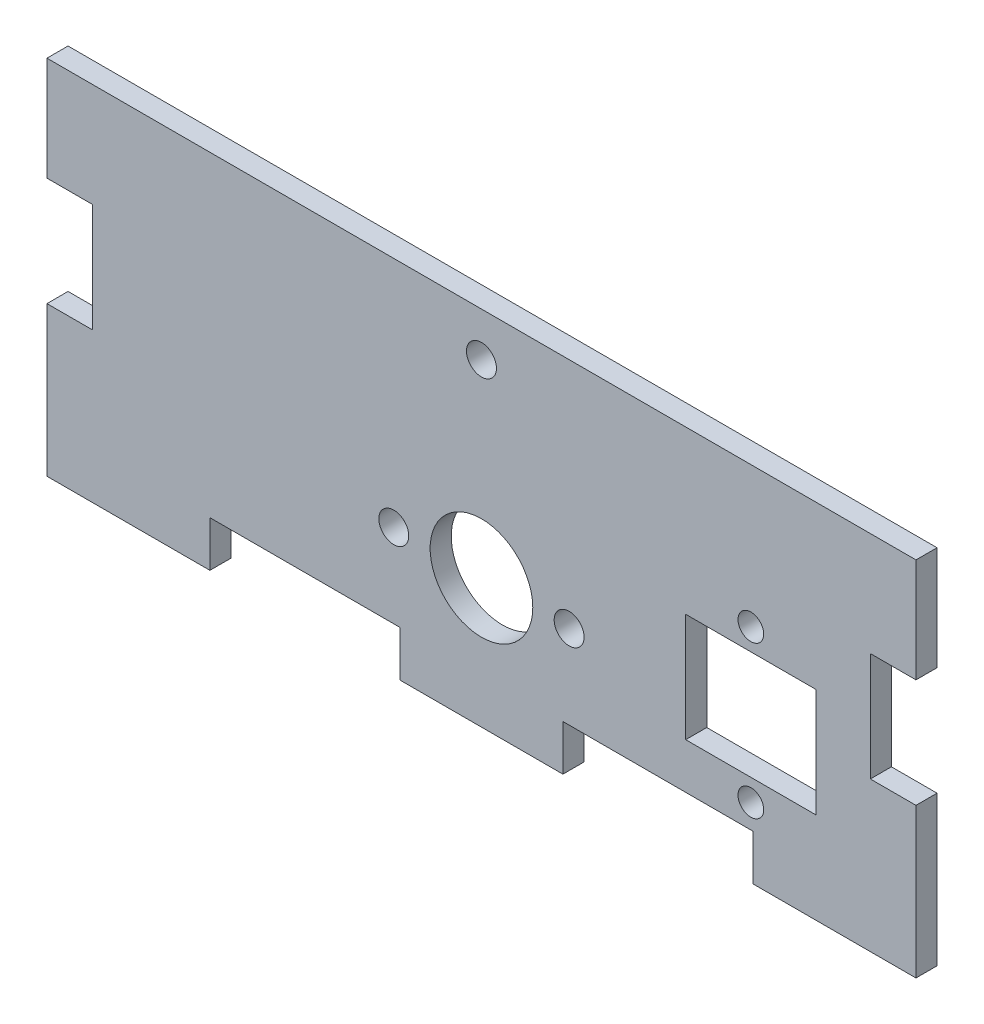
ISO-10303-21;
HEADER;
FILE_DESCRIPTION(('STEP AP214'),'2;1');
FILE_NAME('part.step','',(''),(''),'','','');
FILE_SCHEMA(('AUTOMOTIVE_DESIGN { 1 0 10303 214 1 1 1 1 }'));
ENDSEC;
DATA;
#1=APPLICATION_CONTEXT('core data for automotive mechanical design processes');
#2=APPLICATION_PROTOCOL_DEFINITION('international standard','automotive_design',2000,#1);
#3=PRODUCT_CONTEXT('',#1,'mechanical');
#4=PRODUCT('Part','Part','',(#3));
#5=PRODUCT_RELATED_PRODUCT_CATEGORY('part','',(#4));
#6=PRODUCT_DEFINITION_FORMATION('','',#4);
#7=PRODUCT_DEFINITION_CONTEXT('part definition',#1,'design');
#8=PRODUCT_DEFINITION('design','',#6,#7);
#9=PRODUCT_DEFINITION_SHAPE('','',#8);
#10=(LENGTH_UNIT() NAMED_UNIT(*) SI_UNIT(.MILLI.,.METRE.));
#11=(NAMED_UNIT(*) PLANE_ANGLE_UNIT() SI_UNIT($,.RADIAN.));
#12=(NAMED_UNIT(*) SI_UNIT($,.STERADIAN.) SOLID_ANGLE_UNIT());
#13=UNCERTAINTY_MEASURE_WITH_UNIT(LENGTH_MEASURE(1.E-05),#10,'distance_accuracy_value','');
#14=(GEOMETRIC_REPRESENTATION_CONTEXT(3) GLOBAL_UNCERTAINTY_ASSIGNED_CONTEXT((#13)) GLOBAL_UNIT_ASSIGNED_CONTEXT((#10,
#11,#12)) REPRESENTATION_CONTEXT('',''));
#15=CARTESIAN_POINT('',(0.,0.,0.));
#16=DIRECTION('',(0.,0.,1.));
#17=DIRECTION('',(1.,0.,0.));
#18=AXIS2_PLACEMENT_3D('',#15,#16,#17);
#19=CARTESIAN_POINT('',(-50.8,18.5,-2.4638));
#20=DIRECTION('',(-1.,0.,0.));
#21=DIRECTION('',(0.,-1.,0.));
#22=AXIS2_PLACEMENT_3D('',#19,#20,#21);
#23=PLANE('',#22);
#24=DIRECTION('',(0.,0.,1.));
#25=VECTOR('',#24,1.);
#26=CARTESIAN_POINT('',(-50.8,6.34999999999998,-2.46385));
#27=LINE('',#26,#25);
#28=CARTESIAN_POINT('',(-50.8,6.34999999999998,-2.4638));
#29=VERTEX_POINT('',#28);
#30=CARTESIAN_POINT('',(-50.8,6.34999999999998,0.));
#31=VERTEX_POINT('',#30);
#32=EDGE_CURVE('E240',#29,#31,#27,.T.);
#33=ORIENTED_EDGE('',*,*,#32,.T.);
#34=DIRECTION('',(0.,-1.,0.));
#35=VECTOR('',#34,1.);
#36=CARTESIAN_POINT('',(-50.8,18.5,0.));
#37=LINE('',#36,#35);
#38=CARTESIAN_POINT('',(-50.8,18.5,0.));
#39=VERTEX_POINT('',#38);
#40=EDGE_CURVE('E360',#39,#31,#37,.T.);
#41=ORIENTED_EDGE('',*,*,#40,.F.);
#42=DIRECTION('',(0.,0.,1.));
#43=VECTOR('',#42,1.);
#44=CARTESIAN_POINT('',(-50.8,18.5,-2.4638));
#45=LINE('',#44,#43);
#46=CARTESIAN_POINT('',(-50.8,18.5,-2.4638));
#47=VERTEX_POINT('',#46);
#48=EDGE_CURVE('E11',#47,#39,#45,.T.);
#49=ORIENTED_EDGE('',*,*,#48,.F.);
#50=DIRECTION('',(0.,-1.,0.));
#51=VECTOR('',#50,1.);
#52=CARTESIAN_POINT('',(-50.8,18.5,-2.4638));
#53=LINE('',#52,#51);
#54=EDGE_CURVE('E378',#47,#29,#53,.T.);
#55=ORIENTED_EDGE('',*,*,#54,.T.);
#56=EDGE_LOOP('',(#33,#41,#49,#55));
#57=FACE_BOUND('',#56,.T.);
#58=ADVANCED_FACE('F32',(#57),#23,.T.);
#59=CARTESIAN_POINT('',(50.8,18.5,-2.4638));
#60=DIRECTION('',(1.,0.,0.));
#61=DIRECTION('',(0.,1.,0.));
#62=AXIS2_PLACEMENT_3D('',#59,#60,#61);
#63=PLANE('',#62);
#64=DIRECTION('',(0.,0.,1.));
#65=VECTOR('',#64,1.);
#66=CARTESIAN_POINT('',(50.8,-6.34999999999999,-2.46385));
#67=LINE('',#66,#65);
#68=CARTESIAN_POINT('',(50.8,-6.34999999999999,-2.4638));
#69=VERTEX_POINT('',#68);
#70=CARTESIAN_POINT('',(50.8,-6.34999999999999,0.));
#71=VERTEX_POINT('',#70);
#72=EDGE_CURVE('E267',#69,#71,#67,.T.);
#73=ORIENTED_EDGE('',*,*,#72,.T.);
#74=DIRECTION('',(0.,1.,0.));
#75=VECTOR('',#74,1.);
#76=CARTESIAN_POINT('',(50.8,18.5,0.));
#77=LINE('',#76,#75);
#78=CARTESIAN_POINT('',(50.8,-23.834,0.));
#79=VERTEX_POINT('',#78);
#80=EDGE_CURVE('E393',#79,#71,#77,.T.);
#81=ORIENTED_EDGE('',*,*,#80,.F.);
#82=DIRECTION('',(0.,0.,1.));
#83=VECTOR('',#82,1.);
#84=CARTESIAN_POINT('',(50.8,-23.834,0.));
#85=LINE('',#84,#83);
#86=CARTESIAN_POINT('',(50.8,-23.834,-2.4638));
#87=VERTEX_POINT('',#86);
#88=EDGE_CURVE('E293',#87,#79,#85,.T.);
#89=ORIENTED_EDGE('',*,*,#88,.F.);
#90=DIRECTION('',(0.,1.,0.));
#91=VECTOR('',#90,1.);
#92=CARTESIAN_POINT('',(50.8,18.5,-2.4638));
#93=LINE('',#92,#91);
#94=EDGE_CURVE('E461',#87,#69,#93,.T.);
#95=ORIENTED_EDGE('',*,*,#94,.T.);
#96=EDGE_LOOP('',(#73,#81,#89,#95));
#97=FACE_BOUND('',#96,.T.);
#98=ADVANCED_FACE('F460',(#97),#63,.T.);
#99=CARTESIAN_POINT('',(-50.8,-18.5,-2.4638));
#100=DIRECTION('',(0.,-1.,0.));
#101=DIRECTION('',(0.,0.,-1.));
#102=AXIS2_PLACEMENT_3D('',#99,#100,#101);
#103=PLANE('',#102);
#104=DIRECTION('',(1.,0.,0.));
#105=VECTOR('',#104,1.);
#106=CARTESIAN_POINT('',(-50.8,-18.5,-2.4638));
#107=LINE('',#106,#105);
#108=CARTESIAN_POINT('',(9.525,-18.5,-2.4638));
#109=VERTEX_POINT('',#108);
#110=CARTESIAN_POINT('',(31.75,-18.5,-2.4638));
#111=VERTEX_POINT('',#110);
#112=EDGE_CURVE('E36',#109,#111,#107,.T.);
#113=ORIENTED_EDGE('',*,*,#112,.T.);
#114=DIRECTION('',(0.,0.,-1.));
#115=VECTOR('',#114,1.);
#116=CARTESIAN_POINT('',(31.75,-18.5,0.));
#117=LINE('',#116,#115);
#118=CARTESIAN_POINT('',(31.75,-18.5,0.));
#119=VERTEX_POINT('',#118);
#120=EDGE_CURVE('E284',#119,#111,#117,.T.);
#121=ORIENTED_EDGE('',*,*,#120,.F.);
#122=DIRECTION('',(1.,0.,0.));
#123=VECTOR('',#122,1.);
#124=CARTESIAN_POINT('',(-50.8,-18.5,0.));
#125=LINE('',#124,#123);
#126=CARTESIAN_POINT('',(9.525,-18.5,0.));
#127=VERTEX_POINT('',#126);
#128=EDGE_CURVE('E356',#127,#119,#125,.T.);
#129=ORIENTED_EDGE('',*,*,#128,.F.);
#130=DIRECTION('',(0.,0.,1.));
#131=VECTOR('',#130,1.);
#132=CARTESIAN_POINT('',(9.525,-18.5,0.));
#133=LINE('',#132,#131);
#134=EDGE_CURVE('E307',#109,#127,#133,.T.);
#135=ORIENTED_EDGE('',*,*,#134,.F.);
#136=EDGE_LOOP('',(#113,#121,#129,#135));
#137=FACE_BOUND('',#136,.T.);
#138=ADVANCED_FACE('F448',(#137),#103,.T.);
#139=CARTESIAN_POINT('',(-31.75,-18.5,-2.4638));
#140=VERTEX_POINT('',#139);
#141=CARTESIAN_POINT('',(-9.525,-18.5,-2.4638));
#142=VERTEX_POINT('',#141);
#143=EDGE_CURVE('E345',#140,#142,#107,.T.);
#144=ORIENTED_EDGE('',*,*,#143,.T.);
#145=DIRECTION('',(0.,0.,-1.));
#146=VECTOR('',#145,1.);
#147=CARTESIAN_POINT('',(-9.525,-18.5,0.));
#148=LINE('',#147,#146);
#149=CARTESIAN_POINT('',(-9.525,-18.5,0.));
#150=VERTEX_POINT('',#149);
#151=EDGE_CURVE('E302',#150,#142,#148,.T.);
#152=ORIENTED_EDGE('',*,*,#151,.F.);
#153=CARTESIAN_POINT('',(-31.75,-18.5,0.));
#154=VERTEX_POINT('',#153);
#155=EDGE_CURVE('E359',#154,#150,#125,.T.);
#156=ORIENTED_EDGE('',*,*,#155,.F.);
#157=DIRECTION('',(0.,0.,1.));
#158=VECTOR('',#157,1.);
#159=CARTESIAN_POINT('',(-31.75,-18.5,0.));
#160=LINE('',#159,#158);
#161=EDGE_CURVE('E325',#140,#154,#160,.T.);
#162=ORIENTED_EDGE('',*,*,#161,.F.);
#163=EDGE_LOOP('',(#144,#152,#156,#162));
#164=FACE_BOUND('',#163,.T.);
#165=ADVANCED_FACE('F434',(#164),#103,.T.);
#166=DIRECTION('',(0.,0.,1.));
#167=VECTOR('',#166,1.);
#168=CARTESIAN_POINT('',(50.8,6.35000000000001,-2.46385));
#169=LINE('',#168,#167);
#170=CARTESIAN_POINT('',(50.8,6.35000000000001,-2.4638));
#171=VERTEX_POINT('',#170);
#172=CARTESIAN_POINT('',(50.8,6.35,0.));
#173=VERTEX_POINT('',#172);
#174=EDGE_CURVE('E266',#171,#173,#169,.T.);
#175=ORIENTED_EDGE('',*,*,#174,.F.);
#176=CARTESIAN_POINT('',(50.8,18.5,-2.4638));
#177=VERTEX_POINT('',#176);
#178=EDGE_CURVE('E367',#171,#177,#93,.T.);
#179=ORIENTED_EDGE('',*,*,#178,.T.);
#180=DIRECTION('',(0.,0.,1.));
#181=VECTOR('',#180,1.);
#182=CARTESIAN_POINT('',(50.8,18.5,-2.4638));
#183=LINE('',#182,#181);
#184=CARTESIAN_POINT('',(50.8,18.5,0.));
#185=VERTEX_POINT('',#184);
#186=EDGE_CURVE('E42',#177,#185,#183,.T.);
#187=ORIENTED_EDGE('',*,*,#186,.T.);
#188=EDGE_CURVE('E397',#173,#185,#77,.T.);
#189=ORIENTED_EDGE('',*,*,#188,.F.);
#190=EDGE_LOOP('',(#175,#179,#187,#189));
#191=FACE_BOUND('',#190,.T.);
#192=ADVANCED_FACE('F34',(#191),#63,.T.);
#193=DIRECTION('',(0.,0.,1.));
#194=VECTOR('',#193,1.);
#195=CARTESIAN_POINT('',(-50.8,-6.34999999999999,-2.46385));
#196=LINE('',#195,#194);
#197=CARTESIAN_POINT('',(-50.8,-6.34999999999999,-2.4638));
#198=VERTEX_POINT('',#197);
#199=CARTESIAN_POINT('',(-50.8,-6.34999999999999,0.));
#200=VERTEX_POINT('',#199);
#201=EDGE_CURVE('E246',#198,#200,#196,.T.);
#202=ORIENTED_EDGE('',*,*,#201,.F.);
#203=CARTESIAN_POINT('',(-50.8,-23.834,-2.4638));
#204=VERTEX_POINT('',#203);
#205=EDGE_CURVE('E384',#198,#204,#53,.T.);
#206=ORIENTED_EDGE('',*,*,#205,.T.);
#207=DIRECTION('',(0.,0.,-1.));
#208=VECTOR('',#207,1.);
#209=CARTESIAN_POINT('',(-50.8,-23.834,0.));
#210=LINE('',#209,#208);
#211=CARTESIAN_POINT('',(-50.8,-23.834,0.));
#212=VERTEX_POINT('',#211);
#213=EDGE_CURVE('E326',#212,#204,#210,.T.);
#214=ORIENTED_EDGE('',*,*,#213,.F.);
#215=EDGE_CURVE('E399',#200,#212,#37,.T.);
#216=ORIENTED_EDGE('',*,*,#215,.F.);
#217=EDGE_LOOP('',(#202,#206,#214,#216));
#218=FACE_BOUND('',#217,.T.);
#219=ADVANCED_FACE('F424',(#218),#23,.T.);
#220=CARTESIAN_POINT('',(-50.8,18.5,-2.4638));
#221=DIRECTION('',(0.,1.,0.));
#222=DIRECTION('',(0.,0.,1.));
#223=AXIS2_PLACEMENT_3D('',#220,#221,#222);
#224=PLANE('',#223);
#225=DIRECTION('',(-1.,0.,0.));
#226=VECTOR('',#225,1.);
#227=CARTESIAN_POINT('',(-50.8,18.5,0.));
#228=LINE('',#227,#226);
#229=EDGE_CURVE('E396',#185,#39,#228,.T.);
#230=ORIENTED_EDGE('',*,*,#229,.F.);
#231=ORIENTED_EDGE('',*,*,#186,.F.);
#232=DIRECTION('',(-1.,0.,0.));
#233=VECTOR('',#232,1.);
#234=CARTESIAN_POINT('',(-50.8,18.5,-2.4638));
#235=LINE('',#234,#233);
#236=EDGE_CURVE('E388',#177,#47,#235,.T.);
#237=ORIENTED_EDGE('',*,*,#236,.T.);
#238=ORIENTED_EDGE('',*,*,#48,.T.);
#239=EDGE_LOOP('',(#230,#231,#237,#238));
#240=FACE_BOUND('',#239,.T.);
#241=ADVANCED_FACE('F488',(#240),#224,.T.);
#242=CARTESIAN_POINT('',(0.,0.,-2.4638));
#243=DIRECTION('',(0.,0.,1.));
#244=DIRECTION('',(1.,0.,0.));
#245=AXIS2_PLACEMENT_3D('',#242,#243,#244);
#246=PLANE('',#245);
#247=CARTESIAN_POINT('',(31.496,-15.706,-2.4638));
#248=DIRECTION('',(0.,0.,1.));
#249=DIRECTION('',(1.,0.,0.));
#250=AXIS2_PLACEMENT_3D('',#247,#248,#249);
#251=CIRCLE('',#250,1.5);
#252=CARTESIAN_POINT('',(32.996,-15.706,-2.4638));
#253=VERTEX_POINT('',#252);
#254=EDGE_CURVE('E575',#253,#253,#251,.T.);
#255=ORIENTED_EDGE('',*,*,#254,.T.);
#256=EDGE_LOOP('',(#255));
#257=FACE_BOUND('',#256,.T.);
#258=CARTESIAN_POINT('',(31.496,2.074,-2.4638));
#259=DIRECTION('',(0.,0.,1.));
#260=DIRECTION('',(1.,0.,0.));
#261=AXIS2_PLACEMENT_3D('',#258,#259,#260);
#262=CIRCLE('',#261,1.5);
#263=CARTESIAN_POINT('',(32.996,2.074,-2.4638));
#264=VERTEX_POINT('',#263);
#265=EDGE_CURVE('E579',#264,#264,#262,.T.);
#266=ORIENTED_EDGE('',*,*,#265,.T.);
#267=EDGE_LOOP('',(#266));
#268=FACE_BOUND('',#267,.T.);
#269=DIRECTION('',(-1.,0.,0.));
#270=VECTOR('',#269,1.);
#271=CARTESIAN_POINT('',(0.,-0.466,-2.4638));
#272=LINE('',#271,#270);
#273=CARTESIAN_POINT('',(39.116,-0.466,-2.4638));
#274=VERTEX_POINT('',#273);
#275=CARTESIAN_POINT('',(23.876,-0.466,-2.4638));
#276=VERTEX_POINT('',#275);
#277=EDGE_CURVE('E226',#274,#276,#272,.T.);
#278=ORIENTED_EDGE('',*,*,#277,.T.);
#279=DIRECTION('',(0.,-1.,0.));
#280=VECTOR('',#279,1.);
#281=CARTESIAN_POINT('',(23.876,0.,-2.4638));
#282=LINE('',#281,#280);
#283=CARTESIAN_POINT('',(23.876,-13.166,-2.4638));
#284=VERTEX_POINT('',#283);
#285=EDGE_CURVE('E229',#276,#284,#282,.T.);
#286=ORIENTED_EDGE('',*,*,#285,.T.);
#287=DIRECTION('',(1.,0.,0.));
#288=VECTOR('',#287,1.);
#289=CARTESIAN_POINT('',(0.,-13.166,-2.4638));
#290=LINE('',#289,#288);
#291=CARTESIAN_POINT('',(39.116,-13.166,-2.4638));
#292=VERTEX_POINT('',#291);
#293=EDGE_CURVE('E221',#284,#292,#290,.T.);
#294=ORIENTED_EDGE('',*,*,#293,.T.);
#295=DIRECTION('',(0.,1.,0.));
#296=VECTOR('',#295,1.);
#297=CARTESIAN_POINT('',(39.116,0.,-2.4638));
#298=LINE('',#297,#296);
#299=EDGE_CURVE('E201',#292,#274,#298,.T.);
#300=ORIENTED_EDGE('',*,*,#299,.T.);
#301=EDGE_LOOP('',(#278,#286,#294,#300));
#302=FACE_BOUND('',#301,.T.);
#303=CARTESIAN_POINT('',(0.,13.369999996,-2.4638));
#304=DIRECTION('',(0.,0.,1.));
#305=DIRECTION('',(1.,0.,0.));
#306=AXIS2_PLACEMENT_3D('',#303,#304,#305);
#307=CIRCLE('',#306,1.75);
#308=CARTESIAN_POINT('',(1.75,13.369999996,-2.4638));
#309=VERTEX_POINT('',#308);
#310=EDGE_CURVE('E339',#309,#309,#307,.T.);
#311=ORIENTED_EDGE('',*,*,#310,.T.);
#312=EDGE_LOOP('',(#311));
#313=FACE_BOUND('',#312,.T.);
#314=CARTESIAN_POINT('',(10.25,-8.73,-2.4638));
#315=DIRECTION('',(0.,0.,1.));
#316=DIRECTION('',(1.,0.,0.));
#317=AXIS2_PLACEMENT_3D('',#314,#315,#316);
#318=CIRCLE('',#317,1.75);
#319=CARTESIAN_POINT('',(12.,-8.73,-2.4638));
#320=VERTEX_POINT('',#319);
#321=EDGE_CURVE('E595',#320,#320,#318,.T.);
#322=ORIENTED_EDGE('',*,*,#321,.T.);
#323=EDGE_LOOP('',(#322));
#324=FACE_BOUND('',#323,.T.);
#325=CARTESIAN_POINT('',(-10.25,-8.73,-2.4638));
#326=DIRECTION('',(0.,0.,1.));
#327=DIRECTION('',(1.,0.,0.));
#328=AXIS2_PLACEMENT_3D('',#325,#326,#327);
#329=CIRCLE('',#328,1.75);
#330=CARTESIAN_POINT('',(-8.5,-8.73,-2.4638));
#331=VERTEX_POINT('',#330);
#332=EDGE_CURVE('E482',#331,#331,#329,.T.);
#333=ORIENTED_EDGE('',*,*,#332,.T.);
#334=EDGE_LOOP('',(#333));
#335=FACE_BOUND('',#334,.T.);
#336=CARTESIAN_POINT('',(0.,-8.73,-2.4638));
#337=DIRECTION('',(0.,0.,1.));
#338=DIRECTION('',(1.,0.,0.));
#339=AXIS2_PLACEMENT_3D('',#336,#337,#338);
#340=CIRCLE('',#339,6.);
#341=CARTESIAN_POINT('',(6.,-8.73,-2.4638));
#342=VERTEX_POINT('',#341);
#343=EDGE_CURVE('E475',#342,#342,#340,.T.);
#344=ORIENTED_EDGE('',*,*,#343,.T.);
#345=EDGE_LOOP('',(#344));
#346=FACE_BOUND('',#345,.T.);
#347=DIRECTION('',(0.,1.,0.));
#348=VECTOR('',#347,1.);
#349=CARTESIAN_POINT('',(-45.466,0.,-2.4638));
#350=LINE('',#349,#348);
#351=CARTESIAN_POINT('',(-45.466,-6.35,-2.4638));
#352=VERTEX_POINT('',#351);
#353=CARTESIAN_POINT('',(-45.466,6.34999999999999,-2.4638));
#354=VERTEX_POINT('',#353);
#355=EDGE_CURVE('E252',#352,#354,#350,.T.);
#356=ORIENTED_EDGE('',*,*,#355,.T.);
#357=DIRECTION('',(-1.,0.,0.));
#358=VECTOR('',#357,1.);
#359=CARTESIAN_POINT('',(0.,6.35000000000001,-2.4638));
#360=LINE('',#359,#358);
#361=EDGE_CURVE('E255',#354,#29,#360,.T.);
#362=ORIENTED_EDGE('',*,*,#361,.T.);
#363=ORIENTED_EDGE('',*,*,#54,.F.);
#364=ORIENTED_EDGE('',*,*,#236,.F.);
#365=ORIENTED_EDGE('',*,*,#178,.F.);
#366=DIRECTION('',(-1.,0.,0.));
#367=VECTOR('',#366,1.);
#368=CARTESIAN_POINT('',(0.,6.35000000000001,-2.4638));
#369=LINE('',#368,#367);
#370=CARTESIAN_POINT('',(45.466,6.35000000000001,-2.4638));
#371=VERTEX_POINT('',#370);
#372=EDGE_CURVE('E270',#171,#371,#369,.T.);
#373=ORIENTED_EDGE('',*,*,#372,.T.);
#374=DIRECTION('',(0.,-1.,0.));
#375=VECTOR('',#374,1.);
#376=CARTESIAN_POINT('',(45.466,0.,-2.4638));
#377=LINE('',#376,#375);
#378=CARTESIAN_POINT('',(45.466,-6.35,-2.4638));
#379=VERTEX_POINT('',#378);
#380=EDGE_CURVE('E278',#371,#379,#377,.T.);
#381=ORIENTED_EDGE('',*,*,#380,.T.);
#382=DIRECTION('',(1.,0.,0.));
#383=VECTOR('',#382,1.);
#384=CARTESIAN_POINT('',(0.,-6.35000000000001,-2.4638));
#385=LINE('',#384,#383);
#386=EDGE_CURVE('E281',#379,#69,#385,.T.);
#387=ORIENTED_EDGE('',*,*,#386,.T.);
#388=ORIENTED_EDGE('',*,*,#94,.F.);
#389=DIRECTION('',(1.,0.,0.));
#390=VECTOR('',#389,1.);
#391=CARTESIAN_POINT('',(50.8,-23.834,-2.4638));
#392=LINE('',#391,#390);
#393=CARTESIAN_POINT('',(31.75,-23.834,-2.4638));
#394=VERTEX_POINT('',#393);
#395=EDGE_CURVE('E290',#394,#87,#392,.T.);
#396=ORIENTED_EDGE('',*,*,#395,.F.);
#397=DIRECTION('',(0.,1.,0.));
#398=VECTOR('',#397,1.);
#399=CARTESIAN_POINT('',(31.75,-23.834,-2.4638));
#400=LINE('',#399,#398);
#401=EDGE_CURVE('E296',#394,#111,#400,.T.);
#402=ORIENTED_EDGE('',*,*,#401,.T.);
#403=ORIENTED_EDGE('',*,*,#112,.F.);
#404=DIRECTION('',(0.,1.,0.));
#405=VECTOR('',#404,1.);
#406=CARTESIAN_POINT('',(9.525,-23.834,-2.4638));
#407=LINE('',#406,#405);
#408=CARTESIAN_POINT('',(9.525,-23.834,-2.4638));
#409=VERTEX_POINT('',#408);
#410=EDGE_CURVE('E321',#409,#109,#407,.T.);
#411=ORIENTED_EDGE('',*,*,#410,.F.);
#412=DIRECTION('',(1.,0.,0.));
#413=VECTOR('',#412,1.);
#414=CARTESIAN_POINT('',(-9.525,-23.834,-2.4638));
#415=LINE('',#414,#413);
#416=CARTESIAN_POINT('',(-9.525,-23.834,-2.4638));
#417=VERTEX_POINT('',#416);
#418=EDGE_CURVE('E306',#417,#409,#415,.T.);
#419=ORIENTED_EDGE('',*,*,#418,.F.);
#420=DIRECTION('',(0.,1.,0.));
#421=VECTOR('',#420,1.);
#422=CARTESIAN_POINT('',(-9.525,-23.834,-2.4638));
#423=LINE('',#422,#421);
#424=EDGE_CURVE('E323',#417,#142,#423,.T.);
#425=ORIENTED_EDGE('',*,*,#424,.T.);
#426=ORIENTED_EDGE('',*,*,#143,.F.);
#427=DIRECTION('',(0.,1.,0.));
#428=VECTOR('',#427,1.);
#429=CARTESIAN_POINT('',(-31.75,-23.834,-2.4638));
#430=LINE('',#429,#428);
#431=CARTESIAN_POINT('',(-31.75,-23.834,-2.4638));
#432=VERTEX_POINT('',#431);
#433=EDGE_CURVE('E349',#432,#140,#430,.T.);
#434=ORIENTED_EDGE('',*,*,#433,.F.);
#435=DIRECTION('',(1.,0.,0.));
#436=VECTOR('',#435,1.);
#437=CARTESIAN_POINT('',(-50.8,-23.834,-2.4638));
#438=LINE('',#437,#436);
#439=EDGE_CURVE('E329',#204,#432,#438,.T.);
#440=ORIENTED_EDGE('',*,*,#439,.F.);
#441=ORIENTED_EDGE('',*,*,#205,.F.);
#442=DIRECTION('',(1.,0.,0.));
#443=VECTOR('',#442,1.);
#444=CARTESIAN_POINT('',(0.,-6.35000000000001,-2.4638));
#445=LINE('',#444,#443);
#446=EDGE_CURVE('E243',#198,#352,#445,.T.);
#447=ORIENTED_EDGE('',*,*,#446,.T.);
#448=EDGE_LOOP('',(#356,#362,#363,#364,#365,#373,#381,#387,#388,#396,#402,#403,#411,#419,#425,
#426,#434,#440,#441,#447));
#449=FACE_BOUND('',#448,.T.);
#450=ADVANCED_FACE('F412',(#257,#268,#302,#313,#324,#335,#346,#449),#246,.F.);
#451=CARTESIAN_POINT('',(0.,0.,0.));
#452=DIRECTION('',(0.,0.,1.));
#453=DIRECTION('',(1.,0.,0.));
#454=AXIS2_PLACEMENT_3D('',#451,#452,#453);
#455=PLANE('',#454);
#456=CARTESIAN_POINT('',(31.496,-15.706,0.));
#457=DIRECTION('',(0.,0.,1.));
#458=DIRECTION('',(1.,0.,0.));
#459=AXIS2_PLACEMENT_3D('',#456,#457,#458);
#460=CIRCLE('',#459,1.5);
#461=CARTESIAN_POINT('',(32.996,-15.706,0.));
#462=VERTEX_POINT('',#461);
#463=EDGE_CURVE('E572',#462,#462,#460,.T.);
#464=ORIENTED_EDGE('',*,*,#463,.F.);
#465=EDGE_LOOP('',(#464));
#466=FACE_BOUND('',#465,.T.);
#467=CARTESIAN_POINT('',(31.496,2.074,0.));
#468=DIRECTION('',(0.,0.,1.));
#469=DIRECTION('',(1.,0.,0.));
#470=AXIS2_PLACEMENT_3D('',#467,#468,#469);
#471=CIRCLE('',#470,1.5);
#472=CARTESIAN_POINT('',(32.996,2.074,0.));
#473=VERTEX_POINT('',#472);
#474=EDGE_CURVE('E576',#473,#473,#471,.T.);
#475=ORIENTED_EDGE('',*,*,#474,.F.);
#476=EDGE_LOOP('',(#475));
#477=FACE_BOUND('',#476,.T.);
#478=DIRECTION('',(0.,-1.,0.));
#479=VECTOR('',#478,1.);
#480=CARTESIAN_POINT('',(23.876,-0.466,0.));
#481=LINE('',#480,#479);
#482=CARTESIAN_POINT('',(23.876,-0.466,0.));
#483=VERTEX_POINT('',#482);
#484=CARTESIAN_POINT('',(23.876,-13.166,0.));
#485=VERTEX_POINT('',#484);
#486=EDGE_CURVE('E58',#483,#485,#481,.T.);
#487=ORIENTED_EDGE('',*,*,#486,.F.);
#488=DIRECTION('',(-1.,0.,0.));
#489=VECTOR('',#488,1.);
#490=CARTESIAN_POINT('',(23.876,-0.466,0.));
#491=LINE('',#490,#489);
#492=CARTESIAN_POINT('',(39.116,-0.466,0.));
#493=VERTEX_POINT('',#492);
#494=EDGE_CURVE('E214',#493,#483,#491,.T.);
#495=ORIENTED_EDGE('',*,*,#494,.F.);
#496=DIRECTION('',(0.,1.,0.));
#497=VECTOR('',#496,1.);
#498=CARTESIAN_POINT('',(39.116,-0.466,0.));
#499=LINE('',#498,#497);
#500=CARTESIAN_POINT('',(39.116,-13.166,0.));
#501=VERTEX_POINT('',#500);
#502=EDGE_CURVE('E198',#501,#493,#499,.T.);
#503=ORIENTED_EDGE('',*,*,#502,.F.);
#504=DIRECTION('',(1.,0.,0.));
#505=VECTOR('',#504,1.);
#506=CARTESIAN_POINT('',(23.876,-13.166,0.));
#507=LINE('',#506,#505);
#508=EDGE_CURVE('E207',#485,#501,#507,.T.);
#509=ORIENTED_EDGE('',*,*,#508,.F.);
#510=EDGE_LOOP('',(#487,#495,#503,#509));
#511=FACE_BOUND('',#510,.T.);
#512=DIRECTION('',(-1.,0.,0.));
#513=VECTOR('',#512,1.);
#514=CARTESIAN_POINT('',(-50.8,6.34999999999998,0.));
#515=LINE('',#514,#513);
#516=CARTESIAN_POINT('',(-45.466,6.34999999999999,0.));
#517=VERTEX_POINT('',#516);
#518=EDGE_CURVE('E232',#517,#31,#515,.T.);
#519=ORIENTED_EDGE('',*,*,#518,.F.);
#520=DIRECTION('',(0.,1.,0.));
#521=VECTOR('',#520,1.);
#522=CARTESIAN_POINT('',(-45.466,6.34999999999999,0.));
#523=LINE('',#522,#521);
#524=CARTESIAN_POINT('',(-45.466,-6.35,0.));
#525=VERTEX_POINT('',#524);
#526=EDGE_CURVE('E237',#525,#517,#523,.T.);
#527=ORIENTED_EDGE('',*,*,#526,.F.);
#528=DIRECTION('',(1.,0.,0.));
#529=VECTOR('',#528,1.);
#530=CARTESIAN_POINT('',(-50.8,-6.34999999999999,0.));
#531=LINE('',#530,#529);
#532=EDGE_CURVE('E234',#200,#525,#531,.T.);
#533=ORIENTED_EDGE('',*,*,#532,.F.);
#534=ORIENTED_EDGE('',*,*,#215,.T.);
#535=DIRECTION('',(-1.,0.,0.));
#536=VECTOR('',#535,1.);
#537=CARTESIAN_POINT('',(-50.8,-23.834,0.));
#538=LINE('',#537,#536);
#539=CARTESIAN_POINT('',(-31.75,-23.834,0.));
#540=VERTEX_POINT('',#539);
#541=EDGE_CURVE('E333',#540,#212,#538,.T.);
#542=ORIENTED_EDGE('',*,*,#541,.F.);
#543=DIRECTION('',(0.,1.,0.));
#544=VECTOR('',#543,1.);
#545=CARTESIAN_POINT('',(-31.75,-23.834,0.));
#546=LINE('',#545,#544);
#547=EDGE_CURVE('E336',#540,#154,#546,.T.);
#548=ORIENTED_EDGE('',*,*,#547,.T.);
#549=ORIENTED_EDGE('',*,*,#155,.T.);
#550=DIRECTION('',(0.,1.,0.));
#551=VECTOR('',#550,1.);
#552=CARTESIAN_POINT('',(-9.525,-23.834,0.));
#553=LINE('',#552,#551);
#554=CARTESIAN_POINT('',(-9.525,-23.834,0.));
#555=VERTEX_POINT('',#554);
#556=EDGE_CURVE('E313',#555,#150,#553,.T.);
#557=ORIENTED_EDGE('',*,*,#556,.F.);
#558=DIRECTION('',(-1.,0.,0.));
#559=VECTOR('',#558,1.);
#560=CARTESIAN_POINT('',(-9.525,-23.834,0.));
#561=LINE('',#560,#559);
#562=CARTESIAN_POINT('',(9.525,-23.834,0.));
#563=VERTEX_POINT('',#562);
#564=EDGE_CURVE('E311',#563,#555,#561,.T.);
#565=ORIENTED_EDGE('',*,*,#564,.F.);
#566=DIRECTION('',(0.,1.,0.));
#567=VECTOR('',#566,1.);
#568=CARTESIAN_POINT('',(9.525,-23.834,0.));
#569=LINE('',#568,#567);
#570=EDGE_CURVE('E319',#563,#127,#569,.T.);
#571=ORIENTED_EDGE('',*,*,#570,.T.);
#572=ORIENTED_EDGE('',*,*,#128,.T.);
#573=DIRECTION('',(0.,1.,0.));
#574=VECTOR('',#573,1.);
#575=CARTESIAN_POINT('',(31.75,-23.834,0.));
#576=LINE('',#575,#574);
#577=CARTESIAN_POINT('',(31.75,-23.834,0.));
#578=VERTEX_POINT('',#577);
#579=EDGE_CURVE('E300',#578,#119,#576,.T.);
#580=ORIENTED_EDGE('',*,*,#579,.F.);
#581=DIRECTION('',(-1.,0.,0.));
#582=VECTOR('',#581,1.);
#583=CARTESIAN_POINT('',(50.8,-23.834,0.));
#584=LINE('',#583,#582);
#585=EDGE_CURVE('E285',#79,#578,#584,.T.);
#586=ORIENTED_EDGE('',*,*,#585,.F.);
#587=ORIENTED_EDGE('',*,*,#80,.T.);
#588=DIRECTION('',(1.,0.,0.));
#589=VECTOR('',#588,1.);
#590=CARTESIAN_POINT('',(50.8,-6.34999999999999,0.));
#591=LINE('',#590,#589);
#592=CARTESIAN_POINT('',(45.466,-6.35,0.));
#593=VERTEX_POINT('',#592);
#594=EDGE_CURVE('E264',#593,#71,#591,.T.);
#595=ORIENTED_EDGE('',*,*,#594,.F.);
#596=DIRECTION('',(0.,-1.,0.));
#597=VECTOR('',#596,1.);
#598=CARTESIAN_POINT('',(45.466,6.35000000000001,0.));
#599=LINE('',#598,#597);
#600=CARTESIAN_POINT('',(45.466,6.35000000000001,0.));
#601=VERTEX_POINT('',#600);
#602=EDGE_CURVE('E261',#601,#593,#599,.T.);
#603=ORIENTED_EDGE('',*,*,#602,.F.);
#604=DIRECTION('',(-1.,0.,0.));
#605=VECTOR('',#604,1.);
#606=CARTESIAN_POINT('',(50.8,6.35000000000001,0.));
#607=LINE('',#606,#605);
#608=EDGE_CURVE('E258',#173,#601,#607,.T.);
#609=ORIENTED_EDGE('',*,*,#608,.F.);
#610=ORIENTED_EDGE('',*,*,#188,.T.);
#611=ORIENTED_EDGE('',*,*,#229,.T.);
#612=ORIENTED_EDGE('',*,*,#40,.T.);
#613=EDGE_LOOP('',(#519,#527,#533,#534,#542,#548,#549,#557,#565,#571,#572,#580,#586,#587,#595,
#603,#609,#610,#611,#612));
#614=FACE_BOUND('',#613,.T.);
#615=CARTESIAN_POINT('',(0.,13.369999996,0.));
#616=DIRECTION('',(0.,0.,1.));
#617=DIRECTION('',(1.,0.,0.));
#618=AXIS2_PLACEMENT_3D('',#615,#616,#617);
#619=CIRCLE('',#618,1.75);
#620=CARTESIAN_POINT('',(1.75,13.369999996,0.));
#621=VERTEX_POINT('',#620);
#622=EDGE_CURVE('E354',#621,#621,#619,.T.);
#623=ORIENTED_EDGE('',*,*,#622,.F.);
#624=EDGE_LOOP('',(#623));
#625=FACE_BOUND('',#624,.T.);
#626=CARTESIAN_POINT('',(10.25,-8.73,0.));
#627=DIRECTION('',(0.,0.,1.));
#628=DIRECTION('',(1.,0.,0.));
#629=AXIS2_PLACEMENT_3D('',#626,#627,#628);
#630=CIRCLE('',#629,1.75);
#631=CARTESIAN_POINT('',(12.,-8.73,0.));
#632=VERTEX_POINT('',#631);
#633=EDGE_CURVE('E600',#632,#632,#630,.T.);
#634=ORIENTED_EDGE('',*,*,#633,.F.);
#635=EDGE_LOOP('',(#634));
#636=FACE_BOUND('',#635,.T.);
#637=CARTESIAN_POINT('',(-10.25,-8.73,0.));
#638=DIRECTION('',(0.,0.,1.));
#639=DIRECTION('',(1.,0.,0.));
#640=AXIS2_PLACEMENT_3D('',#637,#638,#639);
#641=CIRCLE('',#640,1.75);
#642=CARTESIAN_POINT('',(-8.5,-8.73,0.));
#643=VERTEX_POINT('',#642);
#644=EDGE_CURVE('E485',#643,#643,#641,.T.);
#645=ORIENTED_EDGE('',*,*,#644,.F.);
#646=EDGE_LOOP('',(#645));
#647=FACE_BOUND('',#646,.T.);
#648=CARTESIAN_POINT('',(0.,-8.73,0.));
#649=DIRECTION('',(0.,0.,1.));
#650=DIRECTION('',(1.,0.,0.));
#651=AXIS2_PLACEMENT_3D('',#648,#649,#650);
#652=CIRCLE('',#651,6.);
#653=CARTESIAN_POINT('',(6.,-8.73,0.));
#654=VERTEX_POINT('',#653);
#655=EDGE_CURVE('E477',#654,#654,#652,.T.);
#656=ORIENTED_EDGE('',*,*,#655,.F.);
#657=EDGE_LOOP('',(#656));
#658=FACE_BOUND('',#657,.T.);
#659=ADVANCED_FACE('F211',(#466,#477,#511,#614,#625,#636,#647,#658),#455,.T.);
#660=CARTESIAN_POINT('',(0.,-8.73,-2.4638));
#661=DIRECTION('',(0.,0.,1.));
#662=DIRECTION('',(1.,0.,0.));
#663=AXIS2_PLACEMENT_3D('',#660,#661,#662);
#664=CYLINDRICAL_SURFACE('',#663,6.);
#665=ORIENTED_EDGE('',*,*,#343,.F.);
#666=EDGE_LOOP('',(#665));
#667=FACE_BOUND('',#666,.T.);
#668=ORIENTED_EDGE('',*,*,#655,.T.);
#669=EDGE_LOOP('',(#668));
#670=FACE_BOUND('',#669,.T.);
#671=ADVANCED_FACE('F505',(#667,#670),#664,.F.);
#672=CARTESIAN_POINT('',(-10.25,-8.73,-2.4638));
#673=DIRECTION('',(0.,0.,1.));
#674=DIRECTION('',(1.,0.,0.));
#675=AXIS2_PLACEMENT_3D('',#672,#673,#674);
#676=CYLINDRICAL_SURFACE('',#675,1.75);
#677=ORIENTED_EDGE('',*,*,#332,.F.);
#678=EDGE_LOOP('',(#677));
#679=FACE_BOUND('',#678,.T.);
#680=ORIENTED_EDGE('',*,*,#644,.T.);
#681=EDGE_LOOP('',(#680));
#682=FACE_BOUND('',#681,.T.);
#683=ADVANCED_FACE('F510',(#679,#682),#676,.F.);
#684=CARTESIAN_POINT('',(10.25,-8.73,-2.4638));
#685=DIRECTION('',(0.,0.,1.));
#686=DIRECTION('',(1.,0.,0.));
#687=AXIS2_PLACEMENT_3D('',#684,#685,#686);
#688=CYLINDRICAL_SURFACE('',#687,1.75);
#689=ORIENTED_EDGE('',*,*,#321,.F.);
#690=EDGE_LOOP('',(#689));
#691=FACE_BOUND('',#690,.T.);
#692=ORIENTED_EDGE('',*,*,#633,.T.);
#693=EDGE_LOOP('',(#692));
#694=FACE_BOUND('',#693,.T.);
#695=ADVANCED_FACE('F514',(#691,#694),#688,.F.);
#696=CARTESIAN_POINT('',(0.,13.369999996,-2.4638));
#697=DIRECTION('',(0.,0.,1.));
#698=DIRECTION('',(1.,0.,0.));
#699=AXIS2_PLACEMENT_3D('',#696,#697,#698);
#700=CYLINDRICAL_SURFACE('',#699,1.75);
#701=ORIENTED_EDGE('',*,*,#310,.F.);
#702=EDGE_LOOP('',(#701));
#703=FACE_BOUND('',#702,.T.);
#704=ORIENTED_EDGE('',*,*,#622,.T.);
#705=EDGE_LOOP('',(#704));
#706=FACE_BOUND('',#705,.T.);
#707=ADVANCED_FACE('F518',(#703,#706),#700,.F.);
#708=CARTESIAN_POINT('',(-31.75,-23.834,0.));
#709=DIRECTION('',(-1.,0.,0.));
#710=DIRECTION('',(0.,0.,1.));
#711=AXIS2_PLACEMENT_3D('',#708,#709,#710);
#712=PLANE('',#711);
#713=ORIENTED_EDGE('',*,*,#161,.T.);
#714=ORIENTED_EDGE('',*,*,#547,.F.);
#715=DIRECTION('',(0.,0.,1.));
#716=VECTOR('',#715,1.);
#717=CARTESIAN_POINT('',(-31.75,-23.834,0.));
#718=LINE('',#717,#716);
#719=EDGE_CURVE('E331',#432,#540,#718,.T.);
#720=ORIENTED_EDGE('',*,*,#719,.F.);
#721=ORIENTED_EDGE('',*,*,#433,.T.);
#722=EDGE_LOOP('',(#713,#714,#720,#721));
#723=FACE_BOUND('',#722,.T.);
#724=ADVANCED_FACE('F433',(#723),#712,.F.);
#725=CARTESIAN_POINT('',(0.,-23.834,0.));
#726=DIRECTION('',(0.,-1.,0.));
#727=DIRECTION('',(0.,0.,-1.));
#728=AXIS2_PLACEMENT_3D('',#725,#726,#727);
#729=PLANE('',#728);
#730=ORIENTED_EDGE('',*,*,#213,.T.);
#731=ORIENTED_EDGE('',*,*,#439,.T.);
#732=ORIENTED_EDGE('',*,*,#719,.T.);
#733=ORIENTED_EDGE('',*,*,#541,.T.);
#734=EDGE_LOOP('',(#730,#731,#732,#733));
#735=FACE_BOUND('',#734,.T.);
#736=ADVANCED_FACE('F427',(#735),#729,.T.);
#737=CARTESIAN_POINT('',(-9.525,-23.834,0.));
#738=DIRECTION('',(1.,0.,0.));
#739=DIRECTION('',(0.,0.,-1.));
#740=AXIS2_PLACEMENT_3D('',#737,#738,#739);
#741=PLANE('',#740);
#742=ORIENTED_EDGE('',*,*,#151,.T.);
#743=ORIENTED_EDGE('',*,*,#424,.F.);
#744=DIRECTION('',(0.,0.,-1.));
#745=VECTOR('',#744,1.);
#746=CARTESIAN_POINT('',(-9.525,-23.834,0.));
#747=LINE('',#746,#745);
#748=EDGE_CURVE('E303',#555,#417,#747,.T.);
#749=ORIENTED_EDGE('',*,*,#748,.F.);
#750=ORIENTED_EDGE('',*,*,#556,.T.);
#751=EDGE_LOOP('',(#742,#743,#749,#750));
#752=FACE_BOUND('',#751,.T.);
#753=ADVANCED_FACE('F439',(#752),#741,.F.);
#754=CARTESIAN_POINT('',(9.525,-23.834,0.));
#755=DIRECTION('',(-1.,0.,0.));
#756=DIRECTION('',(0.,0.,1.));
#757=AXIS2_PLACEMENT_3D('',#754,#755,#756);
#758=PLANE('',#757);
#759=ORIENTED_EDGE('',*,*,#134,.T.);
#760=ORIENTED_EDGE('',*,*,#570,.F.);
#761=DIRECTION('',(0.,0.,1.));
#762=VECTOR('',#761,1.);
#763=CARTESIAN_POINT('',(9.525,-23.834,0.));
#764=LINE('',#763,#762);
#765=EDGE_CURVE('E309',#409,#563,#764,.T.);
#766=ORIENTED_EDGE('',*,*,#765,.F.);
#767=ORIENTED_EDGE('',*,*,#410,.T.);
#768=EDGE_LOOP('',(#759,#760,#766,#767));
#769=FACE_BOUND('',#768,.T.);
#770=ADVANCED_FACE('F446',(#769),#758,.F.);
#771=CARTESIAN_POINT('',(0.,-23.834,0.));
#772=DIRECTION('',(0.,-1.,0.));
#773=DIRECTION('',(0.,0.,-1.));
#774=AXIS2_PLACEMENT_3D('',#771,#772,#773);
#775=PLANE('',#774);
#776=ORIENTED_EDGE('',*,*,#748,.T.);
#777=ORIENTED_EDGE('',*,*,#418,.T.);
#778=ORIENTED_EDGE('',*,*,#765,.T.);
#779=ORIENTED_EDGE('',*,*,#564,.T.);
#780=EDGE_LOOP('',(#776,#777,#778,#779));
#781=FACE_BOUND('',#780,.T.);
#782=ADVANCED_FACE('F443',(#781),#775,.T.);
#783=CARTESIAN_POINT('',(31.75,-23.834,0.));
#784=DIRECTION('',(1.,0.,0.));
#785=DIRECTION('',(0.,0.,-1.));
#786=AXIS2_PLACEMENT_3D('',#783,#784,#785);
#787=PLANE('',#786);
#788=ORIENTED_EDGE('',*,*,#120,.T.);
#789=ORIENTED_EDGE('',*,*,#401,.F.);
#790=DIRECTION('',(0.,0.,-1.));
#791=VECTOR('',#790,1.);
#792=CARTESIAN_POINT('',(31.75,-23.834,0.));
#793=LINE('',#792,#791);
#794=EDGE_CURVE('E288',#578,#394,#793,.T.);
#795=ORIENTED_EDGE('',*,*,#794,.F.);
#796=ORIENTED_EDGE('',*,*,#579,.T.);
#797=EDGE_LOOP('',(#788,#789,#795,#796));
#798=FACE_BOUND('',#797,.T.);
#799=ADVANCED_FACE('F452',(#798),#787,.F.);
#800=CARTESIAN_POINT('',(0.,-23.834,0.));
#801=DIRECTION('',(0.,-1.,0.));
#802=DIRECTION('',(0.,0.,-1.));
#803=AXIS2_PLACEMENT_3D('',#800,#801,#802);
#804=PLANE('',#803);
#805=ORIENTED_EDGE('',*,*,#585,.T.);
#806=ORIENTED_EDGE('',*,*,#794,.T.);
#807=ORIENTED_EDGE('',*,*,#395,.T.);
#808=ORIENTED_EDGE('',*,*,#88,.T.);
#809=EDGE_LOOP('',(#805,#806,#807,#808));
#810=FACE_BOUND('',#809,.T.);
#811=ADVANCED_FACE('F456',(#810),#804,.T.);
#812=CARTESIAN_POINT('',(50.8,-6.34999999999999,-2.46385));
#813=DIRECTION('',(0.,-1.,0.));
#814=DIRECTION('',(1.,0.,0.));
#815=AXIS2_PLACEMENT_3D('',#812,#813,#814);
#816=PLANE('',#815);
#817=DIRECTION('',(0.,0.,1.));
#818=VECTOR('',#817,1.);
#819=CARTESIAN_POINT('',(45.466,-6.35,-2.46385));
#820=LINE('',#819,#818);
#821=EDGE_CURVE('E271',#379,#593,#820,.T.);
#822=ORIENTED_EDGE('',*,*,#821,.T.);
#823=ORIENTED_EDGE('',*,*,#594,.T.);
#824=ORIENTED_EDGE('',*,*,#72,.F.);
#825=ORIENTED_EDGE('',*,*,#386,.F.);
#826=EDGE_LOOP('',(#822,#823,#824,#825));
#827=FACE_BOUND('',#826,.T.);
#828=ADVANCED_FACE('F466',(#827),#816,.F.);
#829=CARTESIAN_POINT('',(45.466,6.35000000000001,-2.46385));
#830=DIRECTION('',(-1.,0.,0.));
#831=DIRECTION('',(0.,0.,1.));
#832=AXIS2_PLACEMENT_3D('',#829,#830,#831);
#833=PLANE('',#832);
#834=DIRECTION('',(0.,0.,1.));
#835=VECTOR('',#834,1.);
#836=CARTESIAN_POINT('',(45.466,6.35000000000001,-2.46385));
#837=LINE('',#836,#835);
#838=EDGE_CURVE('E273',#371,#601,#837,.T.);
#839=ORIENTED_EDGE('',*,*,#838,.T.);
#840=ORIENTED_EDGE('',*,*,#602,.T.);
#841=ORIENTED_EDGE('',*,*,#821,.F.);
#842=ORIENTED_EDGE('',*,*,#380,.F.);
#843=EDGE_LOOP('',(#839,#840,#841,#842));
#844=FACE_BOUND('',#843,.T.);
#845=ADVANCED_FACE('F469',(#844),#833,.F.);
#846=CARTESIAN_POINT('',(50.8,6.35000000000001,-2.46385));
#847=DIRECTION('',(0.,1.,0.));
#848=DIRECTION('',(0.,0.,1.));
#849=AXIS2_PLACEMENT_3D('',#846,#847,#848);
#850=PLANE('',#849);
#851=ORIENTED_EDGE('',*,*,#174,.T.);
#852=ORIENTED_EDGE('',*,*,#608,.T.);
#853=ORIENTED_EDGE('',*,*,#838,.F.);
#854=ORIENTED_EDGE('',*,*,#372,.F.);
#855=EDGE_LOOP('',(#851,#852,#853,#854));
#856=FACE_BOUND('',#855,.T.);
#857=ADVANCED_FACE('F472',(#856),#850,.F.);
#858=CARTESIAN_POINT('',(-50.8,6.34999999999998,-2.46385));
#859=DIRECTION('',(0.,1.,0.));
#860=DIRECTION('',(-1.,0.,0.));
#861=AXIS2_PLACEMENT_3D('',#858,#859,#860);
#862=PLANE('',#861);
#863=DIRECTION('',(0.,0.,1.));
#864=VECTOR('',#863,1.);
#865=CARTESIAN_POINT('',(-45.466,6.34999999999999,-2.46385));
#866=LINE('',#865,#864);
#867=EDGE_CURVE('E241',#354,#517,#866,.T.);
#868=ORIENTED_EDGE('',*,*,#867,.T.);
#869=ORIENTED_EDGE('',*,*,#518,.T.);
#870=ORIENTED_EDGE('',*,*,#32,.F.);
#871=ORIENTED_EDGE('',*,*,#361,.F.);
#872=EDGE_LOOP('',(#868,#869,#870,#871));
#873=FACE_BOUND('',#872,.T.);
#874=ADVANCED_FACE('F409',(#873),#862,.F.);
#875=CARTESIAN_POINT('',(-45.466,6.34999999999999,-2.46385));
#876=DIRECTION('',(1.,0.,0.));
#877=DIRECTION('',(0.,0.,-1.));
#878=AXIS2_PLACEMENT_3D('',#875,#876,#877);
#879=PLANE('',#878);
#880=DIRECTION('',(0.,0.,1.));
#881=VECTOR('',#880,1.);
#882=CARTESIAN_POINT('',(-45.466,-6.35,-2.46385));
#883=LINE('',#882,#881);
#884=EDGE_CURVE('E244',#352,#525,#883,.T.);
#885=ORIENTED_EDGE('',*,*,#884,.T.);
#886=ORIENTED_EDGE('',*,*,#526,.T.);
#887=ORIENTED_EDGE('',*,*,#867,.F.);
#888=ORIENTED_EDGE('',*,*,#355,.F.);
#889=EDGE_LOOP('',(#885,#886,#887,#888));
#890=FACE_BOUND('',#889,.T.);
#891=ADVANCED_FACE('F418',(#890),#879,.F.);
#892=CARTESIAN_POINT('',(-50.8,-6.34999999999999,-2.46385));
#893=DIRECTION('',(0.,-1.,0.));
#894=DIRECTION('',(1.,0.,0.));
#895=AXIS2_PLACEMENT_3D('',#892,#893,#894);
#896=PLANE('',#895);
#897=ORIENTED_EDGE('',*,*,#201,.T.);
#898=ORIENTED_EDGE('',*,*,#532,.T.);
#899=ORIENTED_EDGE('',*,*,#884,.F.);
#900=ORIENTED_EDGE('',*,*,#446,.F.);
#901=EDGE_LOOP('',(#897,#898,#899,#900));
#902=FACE_BOUND('',#901,.T.);
#903=ADVANCED_FACE('F420',(#902),#896,.F.);
#904=CARTESIAN_POINT('',(23.876,-0.466,-2.46385));
#905=DIRECTION('',(-1.,0.,0.));
#906=DIRECTION('',(0.,-1.,0.));
#907=AXIS2_PLACEMENT_3D('',#904,#905,#906);
#908=PLANE('',#907);
#909=DIRECTION('',(0.,0.,1.));
#910=VECTOR('',#909,1.);
#911=CARTESIAN_POINT('',(23.876,-0.466,-2.46385));
#912=LINE('',#911,#910);
#913=EDGE_CURVE('E219',#276,#483,#912,.T.);
#914=ORIENTED_EDGE('',*,*,#913,.T.);
#915=ORIENTED_EDGE('',*,*,#486,.T.);
#916=DIRECTION('',(0.,0.,1.));
#917=VECTOR('',#916,1.);
#918=CARTESIAN_POINT('',(23.876,-13.166,-2.46385));
#919=LINE('',#918,#917);
#920=EDGE_CURVE('E204',#284,#485,#919,.T.);
#921=ORIENTED_EDGE('',*,*,#920,.F.);
#922=ORIENTED_EDGE('',*,*,#285,.F.);
#923=EDGE_LOOP('',(#914,#915,#921,#922));
#924=FACE_BOUND('',#923,.T.);
#925=ADVANCED_FACE('F547',(#924),#908,.F.);
#926=CARTESIAN_POINT('',(23.876,-0.466,-2.46385));
#927=DIRECTION('',(0.,1.,0.));
#928=DIRECTION('',(0.,0.,1.));
#929=AXIS2_PLACEMENT_3D('',#926,#927,#928);
#930=PLANE('',#929);
#931=DIRECTION('',(0.,0.,1.));
#932=VECTOR('',#931,1.);
#933=CARTESIAN_POINT('',(39.116,-0.466,-2.46385));
#934=LINE('',#933,#932);
#935=EDGE_CURVE('E203',#274,#493,#934,.T.);
#936=ORIENTED_EDGE('',*,*,#935,.T.);
#937=ORIENTED_EDGE('',*,*,#494,.T.);
#938=ORIENTED_EDGE('',*,*,#913,.F.);
#939=ORIENTED_EDGE('',*,*,#277,.F.);
#940=EDGE_LOOP('',(#936,#937,#938,#939));
#941=FACE_BOUND('',#940,.T.);
#942=ADVANCED_FACE('F552',(#941),#930,.F.);
#943=CARTESIAN_POINT('',(39.116,-0.466,-2.46385));
#944=DIRECTION('',(1.,0.,0.));
#945=DIRECTION('',(0.,1.,0.));
#946=AXIS2_PLACEMENT_3D('',#943,#944,#945);
#947=PLANE('',#946);
#948=DIRECTION('',(0.,0.,1.));
#949=VECTOR('',#948,1.);
#950=CARTESIAN_POINT('',(39.116,-13.166,-2.46385));
#951=LINE('',#950,#949);
#952=EDGE_CURVE('E50',#292,#501,#951,.T.);
#953=ORIENTED_EDGE('',*,*,#952,.T.);
#954=ORIENTED_EDGE('',*,*,#502,.T.);
#955=ORIENTED_EDGE('',*,*,#935,.F.);
#956=ORIENTED_EDGE('',*,*,#299,.F.);
#957=EDGE_LOOP('',(#953,#954,#955,#956));
#958=FACE_BOUND('',#957,.T.);
#959=ADVANCED_FACE('F195',(#958),#947,.F.);
#960=CARTESIAN_POINT('',(23.876,-13.166,-2.46385));
#961=DIRECTION('',(0.,-1.,0.));
#962=DIRECTION('',(0.,0.,-1.));
#963=AXIS2_PLACEMENT_3D('',#960,#961,#962);
#964=PLANE('',#963);
#965=ORIENTED_EDGE('',*,*,#920,.T.);
#966=ORIENTED_EDGE('',*,*,#508,.T.);
#967=ORIENTED_EDGE('',*,*,#952,.F.);
#968=ORIENTED_EDGE('',*,*,#293,.F.);
#969=EDGE_LOOP('',(#965,#966,#967,#968));
#970=FACE_BOUND('',#969,.T.);
#971=ADVANCED_FACE('F208',(#970),#964,.F.);
#972=CARTESIAN_POINT('',(31.496,2.074,-2.46385));
#973=DIRECTION('',(0.,0.,1.));
#974=DIRECTION('',(1.,0.,0.));
#975=AXIS2_PLACEMENT_3D('',#972,#973,#974);
#976=CYLINDRICAL_SURFACE('',#975,1.5);
#977=ORIENTED_EDGE('',*,*,#474,.T.);
#978=EDGE_LOOP('',(#977));
#979=FACE_BOUND('',#978,.T.);
#980=ORIENTED_EDGE('',*,*,#265,.F.);
#981=EDGE_LOOP('',(#980));
#982=FACE_BOUND('',#981,.T.);
#983=ADVANCED_FACE('F555',(#979,#982),#976,.F.);
#984=CARTESIAN_POINT('',(31.496,-15.706,-2.46385));
#985=DIRECTION('',(0.,0.,1.));
#986=DIRECTION('',(1.,0.,0.));
#987=AXIS2_PLACEMENT_3D('',#984,#985,#986);
#988=CYLINDRICAL_SURFACE('',#987,1.5);
#989=ORIENTED_EDGE('',*,*,#463,.T.);
#990=EDGE_LOOP('',(#989));
#991=FACE_BOUND('',#990,.T.);
#992=ORIENTED_EDGE('',*,*,#254,.F.);
#993=EDGE_LOOP('',(#992));
#994=FACE_BOUND('',#993,.T.);
#995=ADVANCED_FACE('F563',(#991,#994),#988,.F.);
#996=CLOSED_SHELL('',(#58,#98,#138,#165,#192,#219,#241,#450,#659,#671,#683,#695,#707,#724,#736,
#753,#770,#782,#799,#811,#828,#845,#857,#874,#891,#903,#925,#942,#959,#971,#983,#995));
#997=MANIFOLD_SOLID_BREP('B2',#996);
#998=ADVANCED_BREP_SHAPE_REPRESENTATION('',(#18,#997),#14);
#999=SHAPE_DEFINITION_REPRESENTATION(#9,#998);
ENDSEC;
END-ISO-10303-21;
